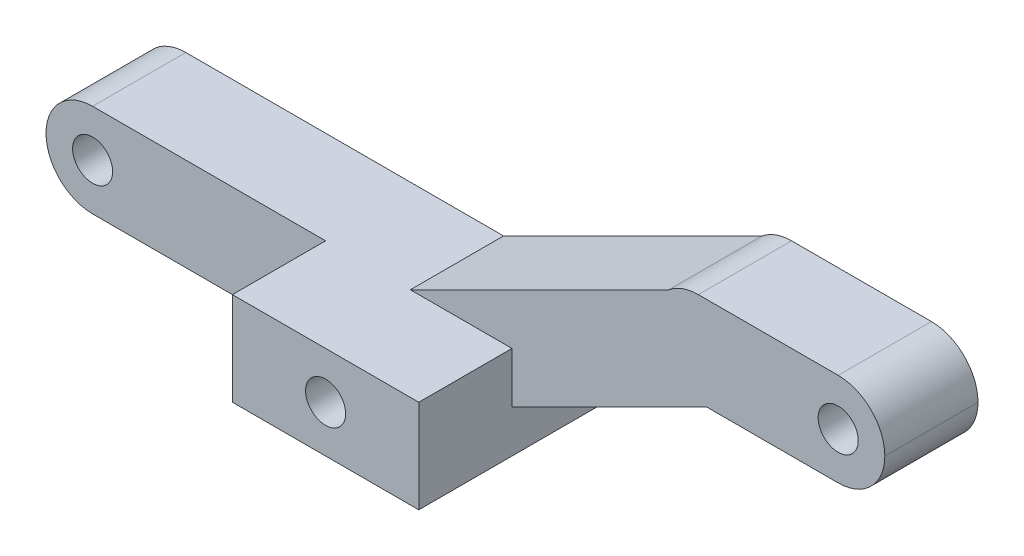
ISO-10303-21;
HEADER;
FILE_DESCRIPTION(('STEP AP214'),'2;1');
FILE_NAME('part.step','',(''),(''),'','','');
FILE_SCHEMA(('AUTOMOTIVE_DESIGN { 1 0 10303 214 1 1 1 1 }'));
ENDSEC;
DATA;
#1=APPLICATION_CONTEXT('core data for automotive mechanical design processes');
#2=APPLICATION_PROTOCOL_DEFINITION('international standard','automotive_design',2000,#1);
#3=PRODUCT_CONTEXT('',#1,'mechanical');
#4=PRODUCT('Part','Part','',(#3));
#5=PRODUCT_RELATED_PRODUCT_CATEGORY('part','',(#4));
#6=PRODUCT_DEFINITION_FORMATION('','',#4);
#7=PRODUCT_DEFINITION_CONTEXT('part definition',#1,'design');
#8=PRODUCT_DEFINITION('design','',#6,#7);
#9=PRODUCT_DEFINITION_SHAPE('','',#8);
#10=(LENGTH_UNIT() NAMED_UNIT(*) SI_UNIT(.MILLI.,.METRE.));
#11=(NAMED_UNIT(*) PLANE_ANGLE_UNIT() SI_UNIT($,.RADIAN.));
#12=(NAMED_UNIT(*) SI_UNIT($,.STERADIAN.) SOLID_ANGLE_UNIT());
#13=UNCERTAINTY_MEASURE_WITH_UNIT(LENGTH_MEASURE(1.E-05),#10,'distance_accuracy_value','');
#14=(GEOMETRIC_REPRESENTATION_CONTEXT(3) GLOBAL_UNCERTAINTY_ASSIGNED_CONTEXT((#13)) GLOBAL_UNIT_ASSIGNED_CONTEXT((#10,
#11,#12)) REPRESENTATION_CONTEXT('',''));
#15=CARTESIAN_POINT('',(0.,0.,0.));
#16=DIRECTION('',(0.,0.,1.));
#17=DIRECTION('',(1.,0.,0.));
#18=AXIS2_PLACEMENT_3D('',#15,#16,#17);
#19=CARTESIAN_POINT('',(23.2009219980755,3.65889360228281,10.));
#20=DIRECTION('',(-0.446929549396,0.89456915768245,0.));
#21=DIRECTION('',(-0.89456915768245,-0.446929549396,0.));
#22=AXIS2_PLACEMENT_3D('',#19,#20,#21);
#23=PLANE('',#22);
#24=DIRECTION('',(0.,0.,1.));
#25=VECTOR('',#24,1.);
#26=CARTESIAN_POINT('',(29.9999999994295,7.05573423931722,10.));
#27=LINE('',#26,#25);
#28=CARTESIAN_POINT('',(29.9999999994295,7.05573423931722,0.));
#29=VERTEX_POINT('',#28);
#30=CARTESIAN_POINT('',(29.9999999994295,7.05573423931722,10.));
#31=VERTEX_POINT('',#30);
#32=EDGE_CURVE('E202',#29,#31,#27,.T.);
#33=ORIENTED_EDGE('',*,*,#32,.F.);
#34=DIRECTION('',(0.89456915768245,0.446929549396,0.));
#35=VECTOR('',#34,1.);
#36=CARTESIAN_POINT('',(23.2009219980755,3.65889360228281,0.));
#37=LINE('',#36,#35);
#38=CARTESIAN_POINT('',(50.9051248379467,17.5,0.));
#39=VERTEX_POINT('',#38);
#40=EDGE_CURVE('E245',#29,#39,#37,.T.);
#41=ORIENTED_EDGE('',*,*,#40,.T.);
#42=DIRECTION('',(0.,0.,-1.));
#43=VECTOR('',#42,1.);
#44=CARTESIAN_POINT('',(50.9051248379467,17.5,10.));
#45=LINE('',#44,#43);
#46=CARTESIAN_POINT('',(50.9051248379467,17.5,10.));
#47=VERTEX_POINT('',#46);
#48=EDGE_CURVE('E230',#47,#39,#45,.T.);
#49=ORIENTED_EDGE('',*,*,#48,.F.);
#50=DIRECTION('',(0.89456915768245,0.446929549396,0.));
#51=VECTOR('',#50,1.);
#52=CARTESIAN_POINT('',(23.2009219980755,3.65889360228281,10.));
#53=LINE('',#52,#51);
#54=EDGE_CURVE('E224',#31,#47,#53,.T.);
#55=ORIENTED_EDGE('',*,*,#54,.F.);
#56=EDGE_LOOP('',(#33,#41,#49,#55));
#57=FACE_BOUND('',#56,.T.);
#58=ADVANCED_FACE('F45',(#57),#23,.F.);
#59=CARTESIAN_POINT('',(19.9999999994295,7.5,10.));
#60=DIRECTION('',(0.,0.,1.));
#61=DIRECTION('',(1.,0.,0.));
#62=AXIS2_PLACEMENT_3D('',#59,#60,#61);
#63=PLANE('',#62);
#64=CARTESIAN_POINT('',(65.,22.5,10.));
#65=DIRECTION('',(0.,0.,1.));
#66=DIRECTION('',(1.,0.,0.));
#67=AXIS2_PLACEMENT_3D('',#64,#65,#66);
#68=CIRCLE('',#67,2.15);
#69=CARTESIAN_POINT('',(67.15,22.5,10.));
#70=VERTEX_POINT('',#69);
#71=EDGE_CURVE('E312',#70,#70,#68,.T.);
#72=ORIENTED_EDGE('',*,*,#71,.F.);
#73=EDGE_LOOP('',(#72));
#74=FACE_BOUND('',#73,.T.);
#75=CARTESIAN_POINT('',(65.,22.5,10.));
#76=DIRECTION('',(0.,0.,1.));
#77=DIRECTION('',(1.,0.,0.));
#78=AXIS2_PLACEMENT_3D('',#75,#76,#77);
#79=CIRCLE('',#78,5.);
#80=CARTESIAN_POINT('',(65.,17.5,10.));
#81=VERTEX_POINT('',#80);
#82=CARTESIAN_POINT('',(70.,22.5,10.));
#83=VERTEX_POINT('',#82);
#84=EDGE_CURVE('E63',#81,#83,#79,.T.);
#85=ORIENTED_EDGE('',*,*,#84,.T.);
#86=CARTESIAN_POINT('',(65.,22.5,10.));
#87=DIRECTION('',(0.,0.,1.));
#88=DIRECTION('',(1.,0.,0.));
#89=AXIS2_PLACEMENT_3D('',#86,#87,#88);
#90=CIRCLE('',#89,5.);
#91=CARTESIAN_POINT('',(65.,27.5,10.));
#92=VERTEX_POINT('',#91);
#93=EDGE_CURVE('E55',#83,#92,#90,.T.);
#94=ORIENTED_EDGE('',*,*,#93,.T.);
#95=DIRECTION('',(-1.,0.,0.));
#96=VECTOR('',#95,1.);
#97=CARTESIAN_POINT('',(50.,27.5,10.));
#98=LINE('',#97,#96);
#99=CARTESIAN_POINT('',(50.,27.5,10.));
#100=VERTEX_POINT('',#99);
#101=EDGE_CURVE('E206',#92,#100,#98,.T.);
#102=ORIENTED_EDGE('',*,*,#101,.T.);
#103=CARTESIAN_POINT('',(49.9999999999997,22.5,10.));
#104=DIRECTION('',(0.,0.,1.));
#105=DIRECTION('',(1.,0.,0.));
#106=AXIS2_PLACEMENT_3D('',#103,#104,#105);
#107=CIRCLE('',#106,5.);
#108=CARTESIAN_POINT('',(46.7990780016771,26.3411063979867,10.));
#109=VERTEX_POINT('',#108);
#110=EDGE_CURVE('E209',#100,#109,#107,.T.);
#111=ORIENTED_EDGE('',*,*,#110,.T.);
#112=DIRECTION('',(-0.894569157677418,-0.446929549406072,0.));
#113=VECTOR('',#112,1.);
#114=CARTESIAN_POINT('',(19.0948751620467,12.5,10.));
#115=LINE('',#114,#113);
#116=CARTESIAN_POINT('',(19.0948751620467,12.5,10.));
#117=VERTEX_POINT('',#116);
#118=EDGE_CURVE('E213',#109,#117,#115,.T.);
#119=ORIENTED_EDGE('',*,*,#118,.T.);
#120=DIRECTION('',(1.,0.,0.));
#121=VECTOR('',#120,1.);
#122=CARTESIAN_POINT('',(19.9999999994295,12.5,10.));
#123=LINE('',#122,#121);
#124=CARTESIAN_POINT('',(29.9999999994295,12.5,10.));
#125=VERTEX_POINT('',#124);
#126=EDGE_CURVE('E189',#117,#125,#123,.T.);
#127=ORIENTED_EDGE('',*,*,#126,.T.);
#128=DIRECTION('',(0.,-1.,0.));
#129=VECTOR('',#128,1.);
#130=CARTESIAN_POINT('',(29.9999999994295,7.5,10.));
#131=LINE('',#130,#129);
#132=EDGE_CURVE('E198',#125,#31,#131,.T.);
#133=ORIENTED_EDGE('',*,*,#132,.T.);
#134=ORIENTED_EDGE('',*,*,#54,.T.);
#135=DIRECTION('',(1.,0.,0.));
#136=VECTOR('',#135,1.);
#137=CARTESIAN_POINT('',(50.9051248379467,17.5,10.));
#138=LINE('',#137,#136);
#139=EDGE_CURVE('E227',#47,#81,#138,.T.);
#140=ORIENTED_EDGE('',*,*,#139,.T.);
#141=EDGE_LOOP('',(#85,#94,#102,#111,#119,#127,#133,#134,#140));
#142=FACE_BOUND('',#141,.T.);
#143=ADVANCED_FACE('F354',(#74,#142),#63,.T.);
#144=CARTESIAN_POINT('',(-15.,7.5,10.));
#145=DIRECTION('',(0.,0.,1.));
#146=DIRECTION('',(1.,0.,0.));
#147=AXIS2_PLACEMENT_3D('',#144,#145,#146);
#148=CIRCLE('',#147,2.15);
#149=CARTESIAN_POINT('',(-12.85,7.5,10.));
#150=VERTEX_POINT('',#149);
#151=EDGE_CURVE('E307',#150,#150,#148,.T.);
#152=ORIENTED_EDGE('',*,*,#151,.F.);
#153=EDGE_LOOP('',(#152));
#154=FACE_BOUND('',#153,.T.);
#155=DIRECTION('',(-1.,0.,0.));
#156=VECTOR('',#155,1.);
#157=CARTESIAN_POINT('',(-20.,12.5,10.));
#158=LINE('',#157,#156);
#159=CARTESIAN_POINT('',(9.9999999994295,12.5,10.));
#160=VERTEX_POINT('',#159);
#161=CARTESIAN_POINT('',(-15.,12.5,10.));
#162=VERTEX_POINT('',#161);
#163=EDGE_CURVE('E217',#160,#162,#158,.T.);
#164=ORIENTED_EDGE('',*,*,#163,.T.);
#165=CARTESIAN_POINT('',(-15.,7.5,10.));
#166=DIRECTION('',(0.,0.,1.));
#167=DIRECTION('',(1.,0.,0.));
#168=AXIS2_PLACEMENT_3D('',#165,#166,#167);
#169=CIRCLE('',#168,5.);
#170=CARTESIAN_POINT('',(-20.,7.5,10.));
#171=VERTEX_POINT('',#170);
#172=EDGE_CURVE('E284',#162,#171,#169,.T.);
#173=ORIENTED_EDGE('',*,*,#172,.T.);
#174=CARTESIAN_POINT('',(-15.,7.5,10.));
#175=DIRECTION('',(0.,0.,1.));
#176=DIRECTION('',(1.,0.,0.));
#177=AXIS2_PLACEMENT_3D('',#174,#175,#176);
#178=CIRCLE('',#177,5.);
#179=CARTESIAN_POINT('',(-15.,2.5,10.));
#180=VERTEX_POINT('',#179);
#181=EDGE_CURVE('E281',#171,#180,#178,.T.);
#182=ORIENTED_EDGE('',*,*,#181,.T.);
#183=DIRECTION('',(1.,0.,0.));
#184=VECTOR('',#183,1.);
#185=CARTESIAN_POINT('',(-20.,2.5,10.));
#186=LINE('',#185,#184);
#187=CARTESIAN_POINT('',(9.9999999994295,2.5,10.));
#188=VERTEX_POINT('',#187);
#189=EDGE_CURVE('E221',#180,#188,#186,.T.);
#190=ORIENTED_EDGE('',*,*,#189,.T.);
#191=DIRECTION('',(0.,1.,0.));
#192=VECTOR('',#191,1.);
#193=CARTESIAN_POINT('',(9.9999999994295,7.5,10.));
#194=LINE('',#193,#192);
#195=EDGE_CURVE('E184',#188,#160,#194,.T.);
#196=ORIENTED_EDGE('',*,*,#195,.T.);
#197=EDGE_LOOP('',(#164,#173,#182,#190,#196));
#198=FACE_BOUND('',#197,.T.);
#199=ADVANCED_FACE('F336',(#154,#198),#63,.T.);
#200=CARTESIAN_POINT('',(50.,27.5,10.));
#201=DIRECTION('',(0.,-1.,0.));
#202=DIRECTION('',(1.,0.,0.));
#203=AXIS2_PLACEMENT_3D('',#200,#201,#202);
#204=PLANE('',#203);
#205=ORIENTED_EDGE('',*,*,#101,.F.);
#206=DIRECTION('',(0.,0.,-1.));
#207=VECTOR('',#206,1.);
#208=CARTESIAN_POINT('',(65.,27.5,10.));
#209=LINE('',#208,#207);
#210=CARTESIAN_POINT('',(65.,27.5,0.));
#211=VERTEX_POINT('',#210);
#212=EDGE_CURVE('E290',#92,#211,#209,.T.);
#213=ORIENTED_EDGE('',*,*,#212,.T.);
#214=DIRECTION('',(-1.,0.,0.));
#215=VECTOR('',#214,1.);
#216=CARTESIAN_POINT('',(50.,27.5,0.));
#217=LINE('',#216,#215);
#218=CARTESIAN_POINT('',(50.,27.5,0.));
#219=VERTEX_POINT('',#218);
#220=EDGE_CURVE('E205',#211,#219,#217,.T.);
#221=ORIENTED_EDGE('',*,*,#220,.T.);
#222=DIRECTION('',(0.,0.,-1.));
#223=VECTOR('',#222,1.);
#224=CARTESIAN_POINT('',(50.,27.5,10.));
#225=LINE('',#224,#223);
#226=EDGE_CURVE('E261',#100,#219,#225,.T.);
#227=ORIENTED_EDGE('',*,*,#226,.F.);
#228=EDGE_LOOP('',(#205,#213,#221,#227));
#229=FACE_BOUND('',#228,.T.);
#230=ADVANCED_FACE('F369',(#229),#204,.F.);
#231=CARTESIAN_POINT('',(49.9999999999997,22.5,10.));
#232=DIRECTION('',(0.,0.,-1.));
#233=DIRECTION('',(-1.,0.,0.));
#234=AXIS2_PLACEMENT_3D('',#231,#232,#233);
#235=CYLINDRICAL_SURFACE('',#234,5.);
#236=CARTESIAN_POINT('',(49.9999999999997,22.5,0.));
#237=DIRECTION('',(0.,0.,1.));
#238=DIRECTION('',(1.,0.,0.));
#239=AXIS2_PLACEMENT_3D('',#236,#237,#238);
#240=CIRCLE('',#239,5.);
#241=CARTESIAN_POINT('',(46.7990780016771,26.3411063979867,0.));
#242=VERTEX_POINT('',#241);
#243=EDGE_CURVE('E233',#219,#242,#240,.T.);
#244=ORIENTED_EDGE('',*,*,#243,.T.);
#245=DIRECTION('',(0.,0.,-1.));
#246=VECTOR('',#245,1.);
#247=CARTESIAN_POINT('',(46.7990780016771,26.3411063979867,10.));
#248=LINE('',#247,#246);
#249=EDGE_CURVE('E257',#109,#242,#248,.T.);
#250=ORIENTED_EDGE('',*,*,#249,.F.);
#251=ORIENTED_EDGE('',*,*,#110,.F.);
#252=ORIENTED_EDGE('',*,*,#226,.T.);
#253=EDGE_LOOP('',(#244,#250,#251,#252));
#254=FACE_BOUND('',#253,.T.);
#255=ADVANCED_FACE('F366',(#254),#235,.T.);
#256=CARTESIAN_POINT('',(19.0948751620467,12.5,10.));
#257=DIRECTION('',(0.446929549406073,-0.894569157677418,0.));
#258=DIRECTION('',(0.894569157677418,0.446929549406073,0.));
#259=AXIS2_PLACEMENT_3D('',#256,#257,#258);
#260=PLANE('',#259);
#261=DIRECTION('',(-0.894569157677418,-0.446929549406072,0.));
#262=VECTOR('',#261,1.);
#263=CARTESIAN_POINT('',(19.0948751620467,12.5,0.));
#264=LINE('',#263,#262);
#265=CARTESIAN_POINT('',(19.0948751620467,12.5,0.));
#266=VERTEX_POINT('',#265);
#267=EDGE_CURVE('E236',#242,#266,#264,.T.);
#268=ORIENTED_EDGE('',*,*,#267,.T.);
#269=DIRECTION('',(0.,0.,-1.));
#270=VECTOR('',#269,1.);
#271=CARTESIAN_POINT('',(19.0948751620467,12.5,10.));
#272=LINE('',#271,#270);
#273=EDGE_CURVE('E253',#117,#266,#272,.T.);
#274=ORIENTED_EDGE('',*,*,#273,.F.);
#275=ORIENTED_EDGE('',*,*,#118,.F.);
#276=ORIENTED_EDGE('',*,*,#249,.T.);
#277=EDGE_LOOP('',(#268,#274,#275,#276));
#278=FACE_BOUND('',#277,.T.);
#279=ADVANCED_FACE('F360',(#278),#260,.F.);
#280=CARTESIAN_POINT('',(-20.,12.5,10.));
#281=DIRECTION('',(0.,-1.,0.));
#282=DIRECTION('',(0.,0.,-1.));
#283=AXIS2_PLACEMENT_3D('',#280,#281,#282);
#284=PLANE('',#283);
#285=DIRECTION('',(-1.,0.,0.));
#286=VECTOR('',#285,1.);
#287=CARTESIAN_POINT('',(-20.,12.5,0.));
#288=LINE('',#287,#286);
#289=CARTESIAN_POINT('',(-15.,12.5,0.));
#290=VERTEX_POINT('',#289);
#291=EDGE_CURVE('E239',#266,#290,#288,.T.);
#292=ORIENTED_EDGE('',*,*,#291,.T.);
#293=DIRECTION('',(0.,0.,-1.));
#294=VECTOR('',#293,1.);
#295=CARTESIAN_POINT('',(-15.,12.5,10.));
#296=LINE('',#295,#294);
#297=EDGE_CURVE('E277',#290,#162,#296,.F.);
#298=ORIENTED_EDGE('',*,*,#297,.T.);
#299=ORIENTED_EDGE('',*,*,#163,.F.);
#300=DIRECTION('',(0.,0.,-1.));
#301=VECTOR('',#300,1.);
#302=CARTESIAN_POINT('',(9.9999999994295,12.5,20.));
#303=LINE('',#302,#301);
#304=CARTESIAN_POINT('',(9.9999999994295,12.5,20.));
#305=VERTEX_POINT('',#304);
#306=EDGE_CURVE('E191',#305,#160,#303,.T.);
#307=ORIENTED_EDGE('',*,*,#306,.F.);
#308=DIRECTION('',(-1.,0.,0.));
#309=VECTOR('',#308,1.);
#310=CARTESIAN_POINT('',(19.9999999994295,12.5,20.));
#311=LINE('',#310,#309);
#312=CARTESIAN_POINT('',(29.9999999994295,12.5,20.));
#313=VERTEX_POINT('',#312);
#314=EDGE_CURVE('E165',#313,#305,#311,.T.);
#315=ORIENTED_EDGE('',*,*,#314,.F.);
#316=DIRECTION('',(0.,0.,-1.));
#317=VECTOR('',#316,1.);
#318=CARTESIAN_POINT('',(29.9999999994295,12.5,20.));
#319=LINE('',#318,#317);
#320=EDGE_CURVE('E161',#313,#125,#319,.T.);
#321=ORIENTED_EDGE('',*,*,#320,.T.);
#322=ORIENTED_EDGE('',*,*,#126,.F.);
#323=ORIENTED_EDGE('',*,*,#273,.T.);
#324=EDGE_LOOP('',(#292,#298,#299,#307,#315,#321,#322,#323));
#325=FACE_BOUND('',#324,.T.);
#326=ADVANCED_FACE('F337',(#325),#284,.F.);
#327=CARTESIAN_POINT('',(-20.,2.5,10.));
#328=DIRECTION('',(0.,1.,0.));
#329=DIRECTION('',(0.,0.,1.));
#330=AXIS2_PLACEMENT_3D('',#327,#328,#329);
#331=PLANE('',#330);
#332=CARTESIAN_POINT('',(19.9999999994295,2.5,10.));
#333=DIRECTION('',(0.,-1.,0.));
#334=DIRECTION('',(0.,0.,-1.));
#335=AXIS2_PLACEMENT_3D('',#332,#333,#334);
#336=CIRCLE('',#335,5.);
#337=CARTESIAN_POINT('',(19.9999999994295,2.5,5.));
#338=VERTEX_POINT('',#337);
#339=EDGE_CURVE('E479',#338,#338,#336,.T.);
#340=ORIENTED_EDGE('',*,*,#339,.F.);
#341=EDGE_LOOP('',(#340));
#342=FACE_BOUND('',#341,.T.);
#343=CARTESIAN_POINT('',(12.4999999994295,2.5,17.5));
#344=DIRECTION('',(0.,-1.,0.));
#345=DIRECTION('',(0.,0.,-1.));
#346=AXIS2_PLACEMENT_3D('',#343,#344,#345);
#347=CIRCLE('',#346,1.);
#348=CARTESIAN_POINT('',(12.4999999994295,2.5,16.5));
#349=VERTEX_POINT('',#348);
#350=EDGE_CURVE('E451',#349,#349,#347,.T.);
#351=ORIENTED_EDGE('',*,*,#350,.F.);
#352=EDGE_LOOP('',(#351));
#353=FACE_BOUND('',#352,.T.);
#354=CARTESIAN_POINT('',(27.4999999994295,2.5,2.5));
#355=DIRECTION('',(0.,-1.,0.));
#356=DIRECTION('',(0.,0.,-1.));
#357=AXIS2_PLACEMENT_3D('',#354,#355,#356);
#358=CIRCLE('',#357,1.);
#359=CARTESIAN_POINT('',(27.4999999994295,2.5,1.5));
#360=VERTEX_POINT('',#359);
#361=EDGE_CURVE('E459',#360,#360,#358,.T.);
#362=ORIENTED_EDGE('',*,*,#361,.F.);
#363=EDGE_LOOP('',(#362));
#364=FACE_BOUND('',#363,.T.);
#365=CARTESIAN_POINT('',(12.4999999994295,2.5,2.5));
#366=DIRECTION('',(0.,-1.,0.));
#367=DIRECTION('',(0.,0.,-1.));
#368=AXIS2_PLACEMENT_3D('',#365,#366,#367);
#369=CIRCLE('',#368,1.);
#370=CARTESIAN_POINT('',(12.4999999994295,2.5,1.5));
#371=VERTEX_POINT('',#370);
#372=EDGE_CURVE('E460',#371,#371,#369,.T.);
#373=ORIENTED_EDGE('',*,*,#372,.F.);
#374=EDGE_LOOP('',(#373));
#375=FACE_BOUND('',#374,.T.);
#376=CARTESIAN_POINT('',(27.4999999994295,2.5,17.5));
#377=DIRECTION('',(0.,-1.,0.));
#378=DIRECTION('',(0.,0.,-1.));
#379=AXIS2_PLACEMENT_3D('',#376,#377,#378);
#380=CIRCLE('',#379,1.);
#381=CARTESIAN_POINT('',(27.4999999994295,2.5,16.5));
#382=VERTEX_POINT('',#381);
#383=EDGE_CURVE('E447',#382,#382,#380,.T.);
#384=ORIENTED_EDGE('',*,*,#383,.F.);
#385=EDGE_LOOP('',(#384));
#386=FACE_BOUND('',#385,.T.);
#387=ORIENTED_EDGE('',*,*,#189,.F.);
#388=DIRECTION('',(0.,0.,-1.));
#389=VECTOR('',#388,1.);
#390=CARTESIAN_POINT('',(-15.,2.5,10.));
#391=LINE('',#390,#389);
#392=CARTESIAN_POINT('',(-15.,2.5,0.));
#393=VERTEX_POINT('',#392);
#394=EDGE_CURVE('E287',#180,#393,#391,.T.);
#395=ORIENTED_EDGE('',*,*,#394,.T.);
#396=DIRECTION('',(1.,0.,0.));
#397=VECTOR('',#396,1.);
#398=CARTESIAN_POINT('',(-20.,2.5,0.));
#399=LINE('',#398,#397);
#400=CARTESIAN_POINT('',(29.9999999994295,2.5,0.));
#401=VERTEX_POINT('',#400);
#402=EDGE_CURVE('E181',#393,#401,#399,.T.);
#403=ORIENTED_EDGE('',*,*,#402,.T.);
#404=DIRECTION('',(0.,0.,-1.));
#405=VECTOR('',#404,1.);
#406=CARTESIAN_POINT('',(29.9999999994295,2.5,20.));
#407=LINE('',#406,#405);
#408=CARTESIAN_POINT('',(29.9999999994295,2.5,20.));
#409=VERTEX_POINT('',#408);
#410=EDGE_CURVE('E159',#409,#401,#407,.T.);
#411=ORIENTED_EDGE('',*,*,#410,.F.);
#412=DIRECTION('',(1.,0.,0.));
#413=VECTOR('',#412,1.);
#414=CARTESIAN_POINT('',(19.9999999994295,2.5,20.));
#415=LINE('',#414,#413);
#416=CARTESIAN_POINT('',(9.9999999994295,2.5,20.));
#417=VERTEX_POINT('',#416);
#418=EDGE_CURVE('E166',#417,#409,#415,.T.);
#419=ORIENTED_EDGE('',*,*,#418,.F.);
#420=DIRECTION('',(0.,0.,-1.));
#421=VECTOR('',#420,1.);
#422=CARTESIAN_POINT('',(9.9999999994295,2.5,20.));
#423=LINE('',#422,#421);
#424=EDGE_CURVE('E325',#417,#188,#423,.T.);
#425=ORIENTED_EDGE('',*,*,#424,.T.);
#426=EDGE_LOOP('',(#387,#395,#403,#411,#419,#425));
#427=FACE_BOUND('',#426,.T.);
#428=ADVANCED_FACE('F179',(#342,#353,#364,#375,#386,#427),#331,.F.);
#429=CARTESIAN_POINT('',(50.9051248379467,17.5,10.));
#430=DIRECTION('',(0.,1.,0.));
#431=DIRECTION('',(0.,0.,1.));
#432=AXIS2_PLACEMENT_3D('',#429,#430,#431);
#433=PLANE('',#432);
#434=DIRECTION('',(1.,0.,0.));
#435=VECTOR('',#434,1.);
#436=CARTESIAN_POINT('',(50.9051248379467,17.5,0.));
#437=LINE('',#436,#435);
#438=CARTESIAN_POINT('',(65.,17.5,0.));
#439=VERTEX_POINT('',#438);
#440=EDGE_CURVE('E210',#39,#439,#437,.T.);
#441=ORIENTED_EDGE('',*,*,#440,.T.);
#442=DIRECTION('',(0.,0.,-1.));
#443=VECTOR('',#442,1.);
#444=CARTESIAN_POINT('',(65.,17.5,10.));
#445=LINE('',#444,#443);
#446=EDGE_CURVE('E11',#439,#81,#445,.F.);
#447=ORIENTED_EDGE('',*,*,#446,.T.);
#448=ORIENTED_EDGE('',*,*,#139,.F.);
#449=ORIENTED_EDGE('',*,*,#48,.T.);
#450=EDGE_LOOP('',(#441,#447,#448,#449));
#451=FACE_BOUND('',#450,.T.);
#452=ADVANCED_FACE('F392',(#451),#433,.F.);
#453=CARTESIAN_POINT('',(19.9999999994295,7.5,0.));
#454=DIRECTION('',(0.,0.,1.));
#455=DIRECTION('',(1.,0.,0.));
#456=AXIS2_PLACEMENT_3D('',#453,#454,#455);
#457=PLANE('',#456);
#458=CARTESIAN_POINT('',(-15.,7.5,0.));
#459=DIRECTION('',(0.,0.,1.));
#460=DIRECTION('',(1.,0.,0.));
#461=AXIS2_PLACEMENT_3D('',#458,#459,#460);
#462=CIRCLE('',#461,2.15);
#463=CARTESIAN_POINT('',(-12.85,7.5,0.));
#464=VERTEX_POINT('',#463);
#465=EDGE_CURVE('E428',#464,#464,#462,.T.);
#466=ORIENTED_EDGE('',*,*,#465,.T.);
#467=EDGE_LOOP('',(#466));
#468=FACE_BOUND('',#467,.T.);
#469=CARTESIAN_POINT('',(65.,22.5,0.));
#470=DIRECTION('',(0.,0.,1.));
#471=DIRECTION('',(1.,0.,0.));
#472=AXIS2_PLACEMENT_3D('',#469,#470,#471);
#473=CIRCLE('',#472,2.15);
#474=CARTESIAN_POINT('',(67.15,22.5,0.));
#475=VERTEX_POINT('',#474);
#476=EDGE_CURVE('E432',#475,#475,#473,.T.);
#477=ORIENTED_EDGE('',*,*,#476,.T.);
#478=EDGE_LOOP('',(#477));
#479=FACE_BOUND('',#478,.T.);
#480=CARTESIAN_POINT('',(19.9999999994295,7.5,0.));
#481=DIRECTION('',(0.,0.,1.));
#482=DIRECTION('',(1.,0.,0.));
#483=AXIS2_PLACEMENT_3D('',#480,#481,#482);
#484=CIRCLE('',#483,2.15);
#485=CARTESIAN_POINT('',(22.1499999994295,7.5,0.));
#486=VERTEX_POINT('',#485);
#487=EDGE_CURVE('E318',#486,#486,#484,.T.);
#488=ORIENTED_EDGE('',*,*,#487,.T.);
#489=EDGE_LOOP('',(#488));
#490=FACE_BOUND('',#489,.T.);
#491=CARTESIAN_POINT('',(-15.,7.5,0.));
#492=DIRECTION('',(0.,0.,1.));
#493=DIRECTION('',(1.,0.,0.));
#494=AXIS2_PLACEMENT_3D('',#491,#492,#493);
#495=CIRCLE('',#494,5.);
#496=CARTESIAN_POINT('',(-20.,7.5,0.));
#497=VERTEX_POINT('',#496);
#498=EDGE_CURVE('E271',#393,#497,#495,.F.);
#499=ORIENTED_EDGE('',*,*,#498,.T.);
#500=CARTESIAN_POINT('',(-15.,7.5,0.));
#501=DIRECTION('',(0.,0.,1.));
#502=DIRECTION('',(1.,0.,0.));
#503=AXIS2_PLACEMENT_3D('',#500,#501,#502);
#504=CIRCLE('',#503,5.);
#505=EDGE_CURVE('E274',#497,#290,#504,.F.);
#506=ORIENTED_EDGE('',*,*,#505,.T.);
#507=ORIENTED_EDGE('',*,*,#291,.F.);
#508=ORIENTED_EDGE('',*,*,#267,.F.);
#509=ORIENTED_EDGE('',*,*,#243,.F.);
#510=ORIENTED_EDGE('',*,*,#220,.F.);
#511=CARTESIAN_POINT('',(65.,22.5,0.));
#512=DIRECTION('',(0.,0.,1.));
#513=DIRECTION('',(1.,0.,0.));
#514=AXIS2_PLACEMENT_3D('',#511,#512,#513);
#515=CIRCLE('',#514,5.);
#516=CARTESIAN_POINT('',(70.,22.5,0.));
#517=VERTEX_POINT('',#516);
#518=EDGE_CURVE('E268',#211,#517,#515,.F.);
#519=ORIENTED_EDGE('',*,*,#518,.T.);
#520=CARTESIAN_POINT('',(65.,22.5,0.));
#521=DIRECTION('',(0.,0.,1.));
#522=DIRECTION('',(1.,0.,0.));
#523=AXIS2_PLACEMENT_3D('',#520,#521,#522);
#524=CIRCLE('',#523,5.);
#525=EDGE_CURVE('E265',#517,#439,#524,.F.);
#526=ORIENTED_EDGE('',*,*,#525,.T.);
#527=ORIENTED_EDGE('',*,*,#440,.F.);
#528=ORIENTED_EDGE('',*,*,#40,.F.);
#529=DIRECTION('',(0.,1.,0.));
#530=VECTOR('',#529,1.);
#531=CARTESIAN_POINT('',(29.9999999994295,7.5,0.));
#532=LINE('',#531,#530);
#533=EDGE_CURVE('E176',#401,#29,#532,.T.);
#534=ORIENTED_EDGE('',*,*,#533,.F.);
#535=ORIENTED_EDGE('',*,*,#402,.F.);
#536=EDGE_LOOP('',(#499,#506,#507,#508,#509,#510,#519,#526,#527,#528,#534,#535));
#537=FACE_BOUND('',#536,.T.);
#538=ADVANCED_FACE('F347',(#468,#479,#490,#537),#457,.F.);
#539=CARTESIAN_POINT('',(29.9999999994295,7.5,20.));
#540=DIRECTION('',(-1.,0.,0.));
#541=DIRECTION('',(0.,0.,1.));
#542=AXIS2_PLACEMENT_3D('',#539,#540,#541);
#543=PLANE('',#542);
#544=ORIENTED_EDGE('',*,*,#533,.T.);
#545=ORIENTED_EDGE('',*,*,#32,.T.);
#546=ORIENTED_EDGE('',*,*,#132,.F.);
#547=ORIENTED_EDGE('',*,*,#320,.F.);
#548=DIRECTION('',(0.,1.,0.));
#549=VECTOR('',#548,1.);
#550=CARTESIAN_POINT('',(29.9999999994295,7.5,20.));
#551=LINE('',#550,#549);
#552=EDGE_CURVE('E155',#409,#313,#551,.T.);
#553=ORIENTED_EDGE('',*,*,#552,.F.);
#554=ORIENTED_EDGE('',*,*,#410,.T.);
#555=EDGE_LOOP('',(#544,#545,#546,#547,#553,#554));
#556=FACE_BOUND('',#555,.T.);
#557=ADVANCED_FACE('F157',(#556),#543,.F.);
#558=CARTESIAN_POINT('',(9.9999999994295,7.5,20.));
#559=DIRECTION('',(1.,0.,0.));
#560=DIRECTION('',(0.,0.,-1.));
#561=AXIS2_PLACEMENT_3D('',#558,#559,#560);
#562=PLANE('',#561);
#563=ORIENTED_EDGE('',*,*,#195,.F.);
#564=ORIENTED_EDGE('',*,*,#424,.F.);
#565=DIRECTION('',(0.,-1.,0.));
#566=VECTOR('',#565,1.);
#567=CARTESIAN_POINT('',(9.9999999994295,7.5,20.));
#568=LINE('',#567,#566);
#569=EDGE_CURVE('E171',#305,#417,#568,.T.);
#570=ORIENTED_EDGE('',*,*,#569,.F.);
#571=ORIENTED_EDGE('',*,*,#306,.T.);
#572=EDGE_LOOP('',(#563,#564,#570,#571));
#573=FACE_BOUND('',#572,.T.);
#574=ADVANCED_FACE('F332',(#573),#562,.F.);
#575=CARTESIAN_POINT('',(0.,0.,20.));
#576=DIRECTION('',(0.,0.,1.));
#577=DIRECTION('',(1.,0.,0.));
#578=AXIS2_PLACEMENT_3D('',#575,#576,#577);
#579=PLANE('',#578);
#580=CARTESIAN_POINT('',(19.9999999994295,7.5,20.));
#581=DIRECTION('',(0.,0.,1.));
#582=DIRECTION('',(1.,0.,0.));
#583=AXIS2_PLACEMENT_3D('',#580,#581,#582);
#584=CIRCLE('',#583,2.15);
#585=CARTESIAN_POINT('',(22.1499999994295,7.5,20.));
#586=VERTEX_POINT('',#585);
#587=EDGE_CURVE('E437',#586,#586,#584,.T.);
#588=ORIENTED_EDGE('',*,*,#587,.F.);
#589=EDGE_LOOP('',(#588));
#590=FACE_BOUND('',#589,.T.);
#591=ORIENTED_EDGE('',*,*,#418,.T.);
#592=ORIENTED_EDGE('',*,*,#552,.T.);
#593=ORIENTED_EDGE('',*,*,#314,.T.);
#594=ORIENTED_EDGE('',*,*,#569,.T.);
#595=EDGE_LOOP('',(#591,#592,#593,#594));
#596=FACE_BOUND('',#595,.T.);
#597=ADVANCED_FACE('F169',(#590,#596),#579,.T.);
#598=CARTESIAN_POINT('',(-15.,7.5,10.));
#599=DIRECTION('',(0.,0.,-1.));
#600=DIRECTION('',(-1.,0.,0.));
#601=AXIS2_PLACEMENT_3D('',#598,#599,#600);
#602=CYLINDRICAL_SURFACE('',#601,5.);
#603=ORIENTED_EDGE('',*,*,#394,.F.);
#604=ORIENTED_EDGE('',*,*,#181,.F.);
#605=DIRECTION('',(0.,0.,-1.));
#606=VECTOR('',#605,1.);
#607=CARTESIAN_POINT('',(-20.,7.5,10.));
#608=LINE('',#607,#606);
#609=EDGE_CURVE('E297',#497,#171,#608,.F.);
#610=ORIENTED_EDGE('',*,*,#609,.F.);
#611=ORIENTED_EDGE('',*,*,#498,.F.);
#612=EDGE_LOOP('',(#603,#604,#610,#611));
#613=FACE_BOUND('',#612,.T.);
#614=ADVANCED_FACE('F344',(#613),#602,.T.);
#615=CARTESIAN_POINT('',(-15.,7.5,10.));
#616=DIRECTION('',(0.,0.,-1.));
#617=DIRECTION('',(-1.,0.,0.));
#618=AXIS2_PLACEMENT_3D('',#615,#616,#617);
#619=CYLINDRICAL_SURFACE('',#618,5.);
#620=ORIENTED_EDGE('',*,*,#172,.F.);
#621=ORIENTED_EDGE('',*,*,#297,.F.);
#622=ORIENTED_EDGE('',*,*,#505,.F.);
#623=ORIENTED_EDGE('',*,*,#609,.T.);
#624=EDGE_LOOP('',(#620,#621,#622,#623));
#625=FACE_BOUND('',#624,.T.);
#626=ADVANCED_FACE('F340',(#625),#619,.T.);
#627=CARTESIAN_POINT('',(65.,22.5,10.));
#628=DIRECTION('',(0.,0.,-1.));
#629=DIRECTION('',(-1.,0.,0.));
#630=AXIS2_PLACEMENT_3D('',#627,#628,#629);
#631=CYLINDRICAL_SURFACE('',#630,5.);
#632=DIRECTION('',(0.,0.,-1.));
#633=VECTOR('',#632,1.);
#634=CARTESIAN_POINT('',(70.,22.5,10.));
#635=LINE('',#634,#633);
#636=EDGE_CURVE('E49',#83,#517,#635,.T.);
#637=ORIENTED_EDGE('',*,*,#636,.F.);
#638=ORIENTED_EDGE('',*,*,#84,.F.);
#639=ORIENTED_EDGE('',*,*,#446,.F.);
#640=ORIENTED_EDGE('',*,*,#525,.F.);
#641=EDGE_LOOP('',(#637,#638,#639,#640));
#642=FACE_BOUND('',#641,.T.);
#643=ADVANCED_FACE('F47',(#642),#631,.T.);
#644=CARTESIAN_POINT('',(65.,22.5,10.));
#645=DIRECTION('',(0.,0.,-1.));
#646=DIRECTION('',(-1.,0.,0.));
#647=AXIS2_PLACEMENT_3D('',#644,#645,#646);
#648=CYLINDRICAL_SURFACE('',#647,5.);
#649=ORIENTED_EDGE('',*,*,#93,.F.);
#650=ORIENTED_EDGE('',*,*,#636,.T.);
#651=ORIENTED_EDGE('',*,*,#518,.F.);
#652=ORIENTED_EDGE('',*,*,#212,.F.);
#653=EDGE_LOOP('',(#649,#650,#651,#652));
#654=FACE_BOUND('',#653,.T.);
#655=ADVANCED_FACE('F371',(#654),#648,.T.);
#656=CARTESIAN_POINT('',(19.9999999994295,7.5,0.));
#657=DIRECTION('',(0.,0.,1.));
#658=DIRECTION('',(1.,0.,0.));
#659=AXIS2_PLACEMENT_3D('',#656,#657,#658);
#660=CYLINDRICAL_SURFACE('',#659,2.15);
#661=ORIENTED_EDGE('',*,*,#487,.F.);
#662=EDGE_LOOP('',(#661));
#663=FACE_BOUND('',#662,.T.);
#664=ORIENTED_EDGE('',*,*,#587,.T.);
#665=EDGE_LOOP('',(#664));
#666=FACE_BOUND('',#665,.T.);
#667=ADVANCED_FACE('F379',(#663,#666),#660,.F.);
#668=CARTESIAN_POINT('',(65.,22.5,0.));
#669=DIRECTION('',(0.,0.,1.));
#670=DIRECTION('',(1.,0.,0.));
#671=AXIS2_PLACEMENT_3D('',#668,#669,#670);
#672=CYLINDRICAL_SURFACE('',#671,2.15);
#673=ORIENTED_EDGE('',*,*,#71,.T.);
#674=EDGE_LOOP('',(#673));
#675=FACE_BOUND('',#674,.T.);
#676=ORIENTED_EDGE('',*,*,#476,.F.);
#677=EDGE_LOOP('',(#676));
#678=FACE_BOUND('',#677,.T.);
#679=ADVANCED_FACE('F517',(#675,#678),#672,.F.);
#680=CARTESIAN_POINT('',(-15.,7.5,0.));
#681=DIRECTION('',(0.,0.,1.));
#682=DIRECTION('',(1.,0.,0.));
#683=AXIS2_PLACEMENT_3D('',#680,#681,#682);
#684=CYLINDRICAL_SURFACE('',#683,2.15);
#685=ORIENTED_EDGE('',*,*,#151,.T.);
#686=EDGE_LOOP('',(#685));
#687=FACE_BOUND('',#686,.T.);
#688=ORIENTED_EDGE('',*,*,#465,.F.);
#689=EDGE_LOOP('',(#688));
#690=FACE_BOUND('',#689,.T.);
#691=ADVANCED_FACE('F507',(#687,#690),#684,.F.);
#692=CARTESIAN_POINT('',(27.4999999994295,10.5,17.5));
#693=DIRECTION('',(0.,-1.,0.));
#694=DIRECTION('',(0.,0.,-1.));
#695=AXIS2_PLACEMENT_3D('',#692,#693,#694);
#696=CYLINDRICAL_SURFACE('',#695,1.);
#697=CARTESIAN_POINT('',(27.4999999994295,10.5,17.5));
#698=DIRECTION('',(0.,-1.,0.));
#699=DIRECTION('',(0.,0.,-1.));
#700=AXIS2_PLACEMENT_3D('',#697,#698,#699);
#701=CIRCLE('',#700,1.);
#702=CARTESIAN_POINT('',(27.4999999994295,10.5,16.5));
#703=VERTEX_POINT('',#702);
#704=EDGE_CURVE('E444',#703,#703,#701,.T.);
#705=ORIENTED_EDGE('',*,*,#704,.F.);
#706=EDGE_LOOP('',(#705));
#707=FACE_BOUND('',#706,.T.);
#708=ORIENTED_EDGE('',*,*,#383,.T.);
#709=EDGE_LOOP('',(#708));
#710=FACE_BOUND('',#709,.T.);
#711=ADVANCED_FACE('F504',(#707,#710),#696,.F.);
#712=CARTESIAN_POINT('',(27.4999999994295,10.5,17.5));
#713=DIRECTION('',(0.,-1.,0.));
#714=DIRECTION('',(0.,0.,-1.));
#715=AXIS2_PLACEMENT_3D('',#712,#713,#714);
#716=PLANE('',#715);
#717=ORIENTED_EDGE('',*,*,#704,.T.);
#718=EDGE_LOOP('',(#717));
#719=FACE_BOUND('',#718,.T.);
#720=ADVANCED_FACE('F506',(#719),#716,.T.);
#721=CARTESIAN_POINT('',(12.4999999994295,10.5,2.5));
#722=DIRECTION('',(0.,-1.,0.));
#723=DIRECTION('',(0.,0.,-1.));
#724=AXIS2_PLACEMENT_3D('',#721,#722,#723);
#725=CYLINDRICAL_SURFACE('',#724,1.);
#726=CARTESIAN_POINT('',(12.4999999994295,10.5,2.5));
#727=DIRECTION('',(0.,-1.,0.));
#728=DIRECTION('',(0.,0.,-1.));
#729=AXIS2_PLACEMENT_3D('',#726,#727,#728);
#730=CIRCLE('',#729,1.);
#731=CARTESIAN_POINT('',(12.4999999994295,10.5,1.5));
#732=VERTEX_POINT('',#731);
#733=EDGE_CURVE('E471',#732,#732,#730,.T.);
#734=ORIENTED_EDGE('',*,*,#733,.F.);
#735=EDGE_LOOP('',(#734));
#736=FACE_BOUND('',#735,.T.);
#737=ORIENTED_EDGE('',*,*,#372,.T.);
#738=EDGE_LOOP('',(#737));
#739=FACE_BOUND('',#738,.T.);
#740=ADVANCED_FACE('F514',(#736,#739),#725,.F.);
#741=CARTESIAN_POINT('',(12.4999999994295,10.5,2.5));
#742=DIRECTION('',(0.,-1.,0.));
#743=DIRECTION('',(0.,0.,-1.));
#744=AXIS2_PLACEMENT_3D('',#741,#742,#743);
#745=PLANE('',#744);
#746=ORIENTED_EDGE('',*,*,#733,.T.);
#747=EDGE_LOOP('',(#746));
#748=FACE_BOUND('',#747,.T.);
#749=ADVANCED_FACE('F564',(#748),#745,.T.);
#750=CARTESIAN_POINT('',(27.4999999994295,10.5,2.5));
#751=DIRECTION('',(0.,-1.,0.));
#752=DIRECTION('',(0.,0.,-1.));
#753=AXIS2_PLACEMENT_3D('',#750,#751,#752);
#754=CYLINDRICAL_SURFACE('',#753,1.);
#755=CARTESIAN_POINT('',(27.4999999994295,10.5,2.5));
#756=DIRECTION('',(0.,-1.,0.));
#757=DIRECTION('',(0.,0.,-1.));
#758=AXIS2_PLACEMENT_3D('',#755,#756,#757);
#759=CIRCLE('',#758,1.);
#760=CARTESIAN_POINT('',(27.4999999994295,10.5,1.5));
#761=VERTEX_POINT('',#760);
#762=EDGE_CURVE('E455',#761,#761,#759,.T.);
#763=ORIENTED_EDGE('',*,*,#762,.F.);
#764=EDGE_LOOP('',(#763));
#765=FACE_BOUND('',#764,.T.);
#766=ORIENTED_EDGE('',*,*,#361,.T.);
#767=EDGE_LOOP('',(#766));
#768=FACE_BOUND('',#767,.T.);
#769=ADVANCED_FACE('F574',(#765,#768),#754,.F.);
#770=CARTESIAN_POINT('',(27.4999999994295,10.5,2.5));
#771=DIRECTION('',(0.,-1.,0.));
#772=DIRECTION('',(0.,0.,-1.));
#773=AXIS2_PLACEMENT_3D('',#770,#771,#772);
#774=PLANE('',#773);
#775=ORIENTED_EDGE('',*,*,#762,.T.);
#776=EDGE_LOOP('',(#775));
#777=FACE_BOUND('',#776,.T.);
#778=ADVANCED_FACE('F584',(#777),#774,.T.);
#779=CARTESIAN_POINT('',(12.4999999994295,10.5,17.5));
#780=DIRECTION('',(0.,-1.,0.));
#781=DIRECTION('',(0.,0.,-1.));
#782=AXIS2_PLACEMENT_3D('',#779,#780,#781);
#783=CYLINDRICAL_SURFACE('',#782,1.);
#784=CARTESIAN_POINT('',(12.4999999994295,10.5,17.5));
#785=DIRECTION('',(0.,-1.,0.));
#786=DIRECTION('',(0.,0.,-1.));
#787=AXIS2_PLACEMENT_3D('',#784,#785,#786);
#788=CIRCLE('',#787,1.);
#789=CARTESIAN_POINT('',(12.4999999994295,10.5,16.5));
#790=VERTEX_POINT('',#789);
#791=EDGE_CURVE('E464',#790,#790,#788,.T.);
#792=ORIENTED_EDGE('',*,*,#791,.F.);
#793=EDGE_LOOP('',(#792));
#794=FACE_BOUND('',#793,.T.);
#795=ORIENTED_EDGE('',*,*,#350,.T.);
#796=EDGE_LOOP('',(#795));
#797=FACE_BOUND('',#796,.T.);
#798=ADVANCED_FACE('F594',(#794,#797),#783,.F.);
#799=CARTESIAN_POINT('',(12.4999999994295,10.5,17.5));
#800=DIRECTION('',(0.,-1.,0.));
#801=DIRECTION('',(0.,0.,-1.));
#802=AXIS2_PLACEMENT_3D('',#799,#800,#801);
#803=PLANE('',#802);
#804=ORIENTED_EDGE('',*,*,#791,.T.);
#805=EDGE_LOOP('',(#804));
#806=FACE_BOUND('',#805,.T.);
#807=ADVANCED_FACE('F492',(#806),#803,.T.);
#808=CARTESIAN_POINT('',(19.9999999994295,4.5,10.));
#809=DIRECTION('',(0.,-1.,0.));
#810=DIRECTION('',(0.,0.,-1.));
#811=AXIS2_PLACEMENT_3D('',#808,#809,#810);
#812=CYLINDRICAL_SURFACE('',#811,5.);
#813=CARTESIAN_POINT('',(19.9999999994295,4.5,10.));
#814=DIRECTION('',(0.,-1.,0.));
#815=DIRECTION('',(0.,0.,-1.));
#816=AXIS2_PLACEMENT_3D('',#813,#814,#815);
#817=CIRCLE('',#816,5.);
#818=CARTESIAN_POINT('',(19.9999999994295,4.5,5.));
#819=VERTEX_POINT('',#818);
#820=EDGE_CURVE('E475',#819,#819,#817,.T.);
#821=ORIENTED_EDGE('',*,*,#820,.F.);
#822=EDGE_LOOP('',(#821));
#823=FACE_BOUND('',#822,.T.);
#824=ORIENTED_EDGE('',*,*,#339,.T.);
#825=EDGE_LOOP('',(#824));
#826=FACE_BOUND('',#825,.T.);
#827=ADVANCED_FACE('F489',(#823,#826),#812,.F.);
#828=CARTESIAN_POINT('',(19.9999999994295,4.5,10.));
#829=DIRECTION('',(0.,-1.,0.));
#830=DIRECTION('',(0.,0.,-1.));
#831=AXIS2_PLACEMENT_3D('',#828,#829,#830);
#832=PLANE('',#831);
#833=ORIENTED_EDGE('',*,*,#820,.T.);
#834=EDGE_LOOP('',(#833));
#835=FACE_BOUND('',#834,.T.);
#836=ADVANCED_FACE('F487',(#835),#832,.T.);
#837=CLOSED_SHELL('',(#58,#143,#199,#230,#255,#279,#326,#428,#452,#538,#557,#574,#597,#614,#626,
#643,#655,#667,#679,#691,#711,#720,#740,#749,#769,#778,#798,#807,#827,#836));
#838=MANIFOLD_SOLID_BREP('B2',#837);
#839=ADVANCED_BREP_SHAPE_REPRESENTATION('',(#18,#838),#14);
#840=SHAPE_DEFINITION_REPRESENTATION(#9,#839);
ENDSEC;
END-ISO-10303-21;
